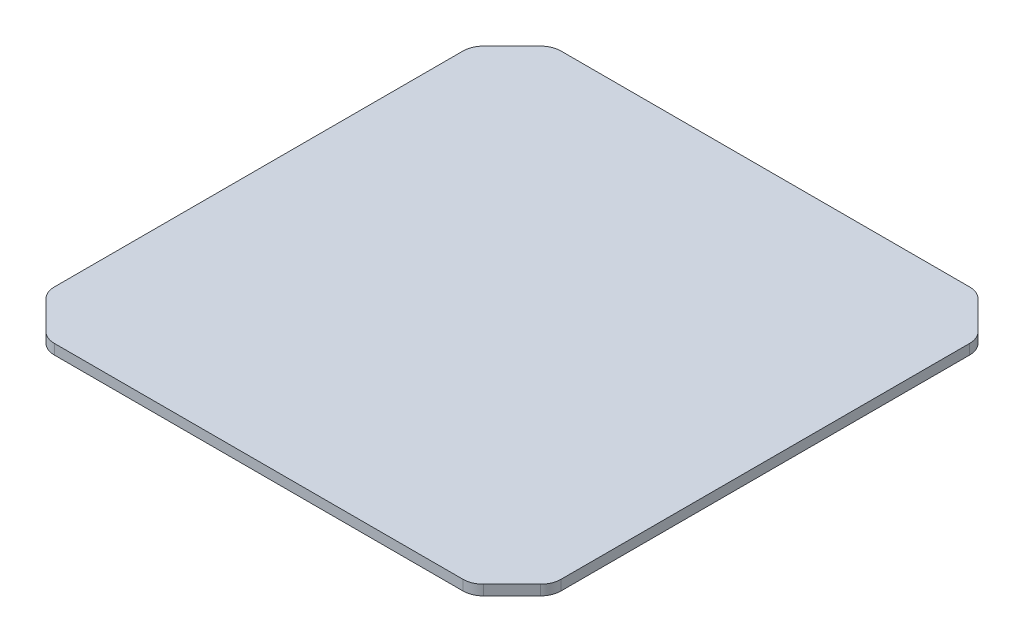
ISO-10303-21;
HEADER;
FILE_DESCRIPTION(('STEP AP214'),'2;1');
FILE_NAME('part.step','',(''),(''),'','','');
FILE_SCHEMA(('AUTOMOTIVE_DESIGN { 1 0 10303 214 1 1 1 1 }'));
ENDSEC;
DATA;
#1=APPLICATION_CONTEXT('core data for automotive mechanical design processes');
#2=APPLICATION_PROTOCOL_DEFINITION('international standard','automotive_design',2000,#1);
#3=PRODUCT_CONTEXT('',#1,'mechanical');
#4=PRODUCT('Part','Part','',(#3));
#5=PRODUCT_RELATED_PRODUCT_CATEGORY('part','',(#4));
#6=PRODUCT_DEFINITION_FORMATION('','',#4);
#7=PRODUCT_DEFINITION_CONTEXT('part definition',#1,'design');
#8=PRODUCT_DEFINITION('design','',#6,#7);
#9=PRODUCT_DEFINITION_SHAPE('','',#8);
#10=(LENGTH_UNIT() NAMED_UNIT(*) SI_UNIT(.MILLI.,.METRE.));
#11=(NAMED_UNIT(*) PLANE_ANGLE_UNIT() SI_UNIT($,.RADIAN.));
#12=(NAMED_UNIT(*) SI_UNIT($,.STERADIAN.) SOLID_ANGLE_UNIT());
#13=UNCERTAINTY_MEASURE_WITH_UNIT(LENGTH_MEASURE(1.E-05),#10,'distance_accuracy_value','');
#14=(GEOMETRIC_REPRESENTATION_CONTEXT(3) GLOBAL_UNCERTAINTY_ASSIGNED_CONTEXT((#13)) GLOBAL_UNIT_ASSIGNED_CONTEXT((#10,
#11,#12)) REPRESENTATION_CONTEXT('',''));
#15=CARTESIAN_POINT('',(0.,0.,0.));
#16=DIRECTION('',(0.,0.,1.));
#17=DIRECTION('',(1.,0.,0.));
#18=AXIS2_PLACEMENT_3D('',#15,#16,#17);
#19=CARTESIAN_POINT('',(125.,5.,125.));
#20=DIRECTION('',(-1.,0.,0.));
#21=DIRECTION('',(0.,0.,1.));
#22=AXIS2_PLACEMENT_3D('',#19,#20,#21);
#23=PLANE('',#22);
#24=DIRECTION('',(0.,0.,-1.));
#25=VECTOR('',#24,1.);
#26=CARTESIAN_POINT('',(125.,0.,125.));
#27=LINE('',#26,#25);
#28=CARTESIAN_POINT('',(125.,0.,100.857864376269));
#29=VERTEX_POINT('',#28);
#30=CARTESIAN_POINT('',(125.,0.,-100.857864376269));
#31=VERTEX_POINT('',#30);
#32=EDGE_CURVE('E170',#29,#31,#27,.T.);
#33=ORIENTED_EDGE('',*,*,#32,.T.);
#34=DIRECTION('',(0.,-1.,0.));
#35=VECTOR('',#34,1.);
#36=CARTESIAN_POINT('',(125.,5.,-100.857864376269));
#37=LINE('',#36,#35);
#38=CARTESIAN_POINT('',(125.,5.,-100.857864376269));
#39=VERTEX_POINT('',#38);
#40=EDGE_CURVE('E174',#31,#39,#37,.F.);
#41=ORIENTED_EDGE('',*,*,#40,.T.);
#42=DIRECTION('',(0.,0.,-1.));
#43=VECTOR('',#42,1.);
#44=CARTESIAN_POINT('',(125.,5.,125.));
#45=LINE('',#44,#43);
#46=CARTESIAN_POINT('',(125.,5.,100.857864376269));
#47=VERTEX_POINT('',#46);
#48=EDGE_CURVE('E173',#47,#39,#45,.T.);
#49=ORIENTED_EDGE('',*,*,#48,.F.);
#50=DIRECTION('',(0.,1.,0.));
#51=VECTOR('',#50,1.);
#52=CARTESIAN_POINT('',(125.,0.,100.857864376269));
#53=LINE('',#52,#51);
#54=EDGE_CURVE('E158',#47,#29,#53,.F.);
#55=ORIENTED_EDGE('',*,*,#54,.T.);
#56=EDGE_LOOP('',(#33,#41,#49,#55));
#57=FACE_BOUND('',#56,.T.);
#58=ADVANCED_FACE('F41',(#57),#23,.F.);
#59=CARTESIAN_POINT('',(-125.,5.,-125.));
#60=DIRECTION('',(0.,0.,1.));
#61=DIRECTION('',(1.,0.,0.));
#62=AXIS2_PLACEMENT_3D('',#59,#60,#61);
#63=PLANE('',#62);
#64=DIRECTION('',(-1.,0.,0.));
#65=VECTOR('',#64,1.);
#66=CARTESIAN_POINT('',(-125.,5.,-125.));
#67=LINE('',#66,#65);
#68=CARTESIAN_POINT('',(100.857864376269,5.,-125.));
#69=VERTEX_POINT('',#68);
#70=CARTESIAN_POINT('',(-100.857864376269,5.,-125.));
#71=VERTEX_POINT('',#70);
#72=EDGE_CURVE('E293',#69,#71,#67,.T.);
#73=ORIENTED_EDGE('',*,*,#72,.F.);
#74=DIRECTION('',(0.,1.,0.));
#75=VECTOR('',#74,1.);
#76=CARTESIAN_POINT('',(100.857864376269,0.,-125.));
#77=LINE('',#76,#75);
#78=CARTESIAN_POINT('',(100.857864376269,0.,-125.));
#79=VERTEX_POINT('',#78);
#80=EDGE_CURVE('E249',#69,#79,#77,.F.);
#81=ORIENTED_EDGE('',*,*,#80,.T.);
#82=DIRECTION('',(-1.,0.,0.));
#83=VECTOR('',#82,1.);
#84=CARTESIAN_POINT('',(-125.,0.,-125.));
#85=LINE('',#84,#83);
#86=CARTESIAN_POINT('',(-100.857864376269,0.,-125.));
#87=VERTEX_POINT('',#86);
#88=EDGE_CURVE('E181',#79,#87,#85,.T.);
#89=ORIENTED_EDGE('',*,*,#88,.T.);
#90=DIRECTION('',(0.,-1.,0.));
#91=VECTOR('',#90,1.);
#92=CARTESIAN_POINT('',(-100.857864376269,5.,-125.));
#93=LINE('',#92,#91);
#94=EDGE_CURVE('E246',#87,#71,#93,.F.);
#95=ORIENTED_EDGE('',*,*,#94,.T.);
#96=EDGE_LOOP('',(#73,#81,#89,#95));
#97=FACE_BOUND('',#96,.T.);
#98=ADVANCED_FACE('F314',(#97),#63,.F.);
#99=CARTESIAN_POINT('',(-125.,5.,125.));
#100=DIRECTION('',(1.,0.,0.));
#101=DIRECTION('',(0.,0.,-1.));
#102=AXIS2_PLACEMENT_3D('',#99,#100,#101);
#103=PLANE('',#102);
#104=DIRECTION('',(0.,0.,1.));
#105=VECTOR('',#104,1.);
#106=CARTESIAN_POINT('',(-125.,5.,125.));
#107=LINE('',#106,#105);
#108=CARTESIAN_POINT('',(-125.,5.,-100.857864376269));
#109=VERTEX_POINT('',#108);
#110=CARTESIAN_POINT('',(-125.,5.,100.857864376269));
#111=VERTEX_POINT('',#110);
#112=EDGE_CURVE('E292',#109,#111,#107,.T.);
#113=ORIENTED_EDGE('',*,*,#112,.F.);
#114=DIRECTION('',(0.,1.,0.));
#115=VECTOR('',#114,1.);
#116=CARTESIAN_POINT('',(-125.,0.,-100.857864376269));
#117=LINE('',#116,#115);
#118=CARTESIAN_POINT('',(-125.,0.,-100.857864376269));
#119=VERTEX_POINT('',#118);
#120=EDGE_CURVE('E255',#109,#119,#117,.F.);
#121=ORIENTED_EDGE('',*,*,#120,.T.);
#122=DIRECTION('',(0.,0.,1.));
#123=VECTOR('',#122,1.);
#124=CARTESIAN_POINT('',(-125.,0.,125.));
#125=LINE('',#124,#123);
#126=CARTESIAN_POINT('',(-125.,0.,100.857864376269));
#127=VERTEX_POINT('',#126);
#128=EDGE_CURVE('E184',#119,#127,#125,.T.);
#129=ORIENTED_EDGE('',*,*,#128,.T.);
#130=DIRECTION('',(0.,-1.,0.));
#131=VECTOR('',#130,1.);
#132=CARTESIAN_POINT('',(-125.,5.,100.857864376269));
#133=LINE('',#132,#131);
#134=EDGE_CURVE('E252',#127,#111,#133,.F.);
#135=ORIENTED_EDGE('',*,*,#134,.T.);
#136=EDGE_LOOP('',(#113,#121,#129,#135));
#137=FACE_BOUND('',#136,.T.);
#138=ADVANCED_FACE('F319',(#137),#103,.F.);
#139=CARTESIAN_POINT('',(-125.,5.,125.));
#140=DIRECTION('',(0.,0.,-1.));
#141=DIRECTION('',(-1.,0.,0.));
#142=AXIS2_PLACEMENT_3D('',#139,#140,#141);
#143=PLANE('',#142);
#144=DIRECTION('',(1.,0.,0.));
#145=VECTOR('',#144,1.);
#146=CARTESIAN_POINT('',(-125.,0.,125.));
#147=LINE('',#146,#145);
#148=CARTESIAN_POINT('',(-100.857864376269,0.,125.));
#149=VERTEX_POINT('',#148);
#150=CARTESIAN_POINT('',(100.857864376269,0.,125.));
#151=VERTEX_POINT('',#150);
#152=EDGE_CURVE('E192',#149,#151,#147,.T.);
#153=ORIENTED_EDGE('',*,*,#152,.T.);
#154=DIRECTION('',(0.,-1.,0.));
#155=VECTOR('',#154,1.);
#156=CARTESIAN_POINT('',(100.857864376269,5.,125.));
#157=LINE('',#156,#155);
#158=CARTESIAN_POINT('',(100.857864376269,5.,125.));
#159=VERTEX_POINT('',#158);
#160=EDGE_CURVE('E264',#151,#159,#157,.F.);
#161=ORIENTED_EDGE('',*,*,#160,.T.);
#162=DIRECTION('',(1.,0.,0.));
#163=VECTOR('',#162,1.);
#164=CARTESIAN_POINT('',(-125.,5.,125.));
#165=LINE('',#164,#163);
#166=CARTESIAN_POINT('',(-100.857864376269,5.,125.));
#167=VERTEX_POINT('',#166);
#168=EDGE_CURVE('E187',#167,#159,#165,.T.);
#169=ORIENTED_EDGE('',*,*,#168,.F.);
#170=DIRECTION('',(0.,1.,0.));
#171=VECTOR('',#170,1.);
#172=CARTESIAN_POINT('',(-100.857864376269,0.,125.));
#173=LINE('',#172,#171);
#174=EDGE_CURVE('E261',#167,#149,#173,.F.);
#175=ORIENTED_EDGE('',*,*,#174,.T.);
#176=EDGE_LOOP('',(#153,#161,#169,#175));
#177=FACE_BOUND('',#176,.T.);
#178=ADVANCED_FACE('F285',(#177),#143,.F.);
#179=CARTESIAN_POINT('',(0.,5.,0.));
#180=DIRECTION('',(0.,-1.,0.));
#181=DIRECTION('',(0.,0.,-1.));
#182=AXIS2_PLACEMENT_3D('',#179,#180,#181);
#183=PLANE('',#182);
#184=ORIENTED_EDGE('',*,*,#48,.T.);
#185=CARTESIAN_POINT('',(115.,5.,-100.857864376269));
#186=DIRECTION('',(0.,-1.,0.));
#187=DIRECTION('',(0.,0.,-1.));
#188=AXIS2_PLACEMENT_3D('',#185,#186,#187);
#189=CIRCLE('',#188,10.);
#190=CARTESIAN_POINT('',(122.071067811866,5.,-107.928932188134));
#191=VERTEX_POINT('',#190);
#192=EDGE_CURVE('E230',#39,#191,#189,.F.);
#193=ORIENTED_EDGE('',*,*,#192,.T.);
#194=DIRECTION('',(0.707106781186546,0.,0.707106781186549));
#195=VECTOR('',#194,1.);
#196=CARTESIAN_POINT('',(105.,5.,-125.));
#197=LINE('',#196,#195);
#198=CARTESIAN_POINT('',(107.928932188135,5.,-122.071067811865));
#199=VERTEX_POINT('',#198);
#200=EDGE_CURVE('E175',#191,#199,#197,.F.);
#201=ORIENTED_EDGE('',*,*,#200,.T.);
#202=CARTESIAN_POINT('',(100.857864376269,5.,-115.));
#203=DIRECTION('',(0.,-1.,0.));
#204=DIRECTION('',(0.,0.,-1.));
#205=AXIS2_PLACEMENT_3D('',#202,#203,#204);
#206=CIRCLE('',#205,10.);
#207=EDGE_CURVE('E228',#199,#69,#206,.F.);
#208=ORIENTED_EDGE('',*,*,#207,.T.);
#209=ORIENTED_EDGE('',*,*,#72,.T.);
#210=CARTESIAN_POINT('',(-100.857864376269,5.,-115.));
#211=DIRECTION('',(0.,-1.,0.));
#212=DIRECTION('',(0.,0.,-1.));
#213=AXIS2_PLACEMENT_3D('',#210,#211,#212);
#214=CIRCLE('',#213,10.);
#215=CARTESIAN_POINT('',(-107.928932188134,5.,-122.071067811866));
#216=VERTEX_POINT('',#215);
#217=EDGE_CURVE('E224',#71,#216,#214,.F.);
#218=ORIENTED_EDGE('',*,*,#217,.T.);
#219=DIRECTION('',(0.707106781186549,0.,-0.707106781186547));
#220=VECTOR('',#219,1.);
#221=CARTESIAN_POINT('',(-125.,5.,-105.));
#222=LINE('',#221,#220);
#223=CARTESIAN_POINT('',(-122.071067811865,5.,-107.928932188135));
#224=VERTEX_POINT('',#223);
#225=EDGE_CURVE('E204',#216,#224,#222,.F.);
#226=ORIENTED_EDGE('',*,*,#225,.T.);
#227=CARTESIAN_POINT('',(-115.,5.,-100.857864376269));
#228=DIRECTION('',(0.,-1.,0.));
#229=DIRECTION('',(0.,0.,-1.));
#230=AXIS2_PLACEMENT_3D('',#227,#228,#229);
#231=CIRCLE('',#230,10.);
#232=EDGE_CURVE('E226',#224,#109,#231,.F.);
#233=ORIENTED_EDGE('',*,*,#232,.T.);
#234=ORIENTED_EDGE('',*,*,#112,.T.);
#235=CARTESIAN_POINT('',(-115.,5.,100.857864376269));
#236=DIRECTION('',(0.,-1.,0.));
#237=DIRECTION('',(0.,0.,-1.));
#238=AXIS2_PLACEMENT_3D('',#235,#236,#237);
#239=CIRCLE('',#238,10.);
#240=CARTESIAN_POINT('',(-122.071067811865,5.,107.928932188134));
#241=VERTEX_POINT('',#240);
#242=EDGE_CURVE('E218',#111,#241,#239,.F.);
#243=ORIENTED_EDGE('',*,*,#242,.T.);
#244=DIRECTION('',(-0.707106781186547,0.,-0.707106781186549));
#245=VECTOR('',#244,1.);
#246=CARTESIAN_POINT('',(-105.,5.,125.));
#247=LINE('',#246,#245);
#248=CARTESIAN_POINT('',(-107.928932188134,5.,122.071067811865));
#249=VERTEX_POINT('',#248);
#250=EDGE_CURVE('E207',#241,#249,#247,.F.);
#251=ORIENTED_EDGE('',*,*,#250,.T.);
#252=CARTESIAN_POINT('',(-100.857864376269,5.,115.));
#253=DIRECTION('',(0.,-1.,0.));
#254=DIRECTION('',(0.,0.,-1.));
#255=AXIS2_PLACEMENT_3D('',#252,#253,#254);
#256=CIRCLE('',#255,10.);
#257=EDGE_CURVE('E216',#249,#167,#256,.F.);
#258=ORIENTED_EDGE('',*,*,#257,.T.);
#259=ORIENTED_EDGE('',*,*,#168,.T.);
#260=CARTESIAN_POINT('',(100.857864376269,5.,115.));
#261=DIRECTION('',(0.,-1.,0.));
#262=DIRECTION('',(0.,0.,-1.));
#263=AXIS2_PLACEMENT_3D('',#260,#261,#262);
#264=CIRCLE('',#263,10.);
#265=CARTESIAN_POINT('',(107.928932188135,5.,122.071067811865));
#266=VERTEX_POINT('',#265);
#267=EDGE_CURVE('E222',#159,#266,#264,.F.);
#268=ORIENTED_EDGE('',*,*,#267,.T.);
#269=DIRECTION('',(-0.707106781186548,0.,0.707106781186547));
#270=VECTOR('',#269,1.);
#271=CARTESIAN_POINT('',(125.,5.,105.));
#272=LINE('',#271,#270);
#273=CARTESIAN_POINT('',(122.071067811866,5.,107.928932188135));
#274=VERTEX_POINT('',#273);
#275=EDGE_CURVE('E210',#266,#274,#272,.F.);
#276=ORIENTED_EDGE('',*,*,#275,.T.);
#277=CARTESIAN_POINT('',(115.,5.,100.857864376269));
#278=DIRECTION('',(0.,-1.,0.));
#279=DIRECTION('',(0.,0.,-1.));
#280=AXIS2_PLACEMENT_3D('',#277,#278,#279);
#281=CIRCLE('',#280,10.);
#282=EDGE_CURVE('E220',#274,#47,#281,.F.);
#283=ORIENTED_EDGE('',*,*,#282,.T.);
#284=EDGE_LOOP('',(#184,#193,#201,#208,#209,#218,#226,#233,#234,#243,#251,#258,#259,#268,#276,#283));
#285=FACE_BOUND('',#284,.T.);
#286=ADVANCED_FACE('F278',(#285),#183,.F.);
#287=CARTESIAN_POINT('',(0.,0.,0.));
#288=DIRECTION('',(0.,-1.,0.));
#289=DIRECTION('',(0.,0.,-1.));
#290=AXIS2_PLACEMENT_3D('',#287,#288,#289);
#291=PLANE('',#290);
#292=DIRECTION('',(-0.707106781186546,0.,-0.707106781186549));
#293=VECTOR('',#292,1.);
#294=CARTESIAN_POINT('',(115.,0.,-115.));
#295=LINE('',#294,#293);
#296=CARTESIAN_POINT('',(107.928932188135,0.,-122.071067811865));
#297=VERTEX_POINT('',#296);
#298=CARTESIAN_POINT('',(122.071067811866,0.,-107.928932188134));
#299=VERTEX_POINT('',#298);
#300=EDGE_CURVE('E202',#297,#299,#295,.F.);
#301=ORIENTED_EDGE('',*,*,#300,.T.);
#302=CARTESIAN_POINT('',(115.,0.,-100.857864376269));
#303=DIRECTION('',(0.,-1.,0.));
#304=DIRECTION('',(0.,0.,-1.));
#305=AXIS2_PLACEMENT_3D('',#302,#303,#304);
#306=CIRCLE('',#305,10.);
#307=EDGE_CURVE('E180',#299,#31,#306,.T.);
#308=ORIENTED_EDGE('',*,*,#307,.T.);
#309=ORIENTED_EDGE('',*,*,#32,.F.);
#310=CARTESIAN_POINT('',(115.,0.,100.857864376269));
#311=DIRECTION('',(0.,-1.,0.));
#312=DIRECTION('',(0.,0.,-1.));
#313=AXIS2_PLACEMENT_3D('',#310,#311,#312);
#314=CIRCLE('',#313,10.);
#315=CARTESIAN_POINT('',(122.071067811866,0.,107.928932188135));
#316=VERTEX_POINT('',#315);
#317=EDGE_CURVE('E154',#29,#316,#314,.T.);
#318=ORIENTED_EDGE('',*,*,#317,.T.);
#319=DIRECTION('',(0.707106781186548,0.,-0.707106781186547));
#320=VECTOR('',#319,1.);
#321=CARTESIAN_POINT('',(115.,0.,115.));
#322=LINE('',#321,#320);
#323=CARTESIAN_POINT('',(107.928932188135,0.,122.071067811865));
#324=VERTEX_POINT('',#323);
#325=EDGE_CURVE('E200',#316,#324,#322,.F.);
#326=ORIENTED_EDGE('',*,*,#325,.T.);
#327=CARTESIAN_POINT('',(100.857864376269,0.,115.));
#328=DIRECTION('',(0.,-1.,0.));
#329=DIRECTION('',(0.,0.,-1.));
#330=AXIS2_PLACEMENT_3D('',#327,#328,#329);
#331=CIRCLE('',#330,10.);
#332=EDGE_CURVE('E163',#324,#151,#331,.T.);
#333=ORIENTED_EDGE('',*,*,#332,.T.);
#334=ORIENTED_EDGE('',*,*,#152,.F.);
#335=CARTESIAN_POINT('',(-100.857864376269,0.,115.));
#336=DIRECTION('',(0.,-1.,0.));
#337=DIRECTION('',(0.,0.,-1.));
#338=AXIS2_PLACEMENT_3D('',#335,#336,#337);
#339=CIRCLE('',#338,10.);
#340=CARTESIAN_POINT('',(-107.928932188135,0.,122.071067811866));
#341=VERTEX_POINT('',#340);
#342=EDGE_CURVE('E236',#149,#341,#339,.T.);
#343=ORIENTED_EDGE('',*,*,#342,.T.);
#344=DIRECTION('',(0.707106781186547,0.,0.707106781186549));
#345=VECTOR('',#344,1.);
#346=CARTESIAN_POINT('',(-115.,0.,115.));
#347=LINE('',#346,#345);
#348=CARTESIAN_POINT('',(-122.071067811866,0.,107.928932188134));
#349=VERTEX_POINT('',#348);
#350=EDGE_CURVE('E197',#341,#349,#347,.F.);
#351=ORIENTED_EDGE('',*,*,#350,.T.);
#352=CARTESIAN_POINT('',(-115.,0.,100.857864376269));
#353=DIRECTION('',(0.,-1.,0.));
#354=DIRECTION('',(0.,0.,-1.));
#355=AXIS2_PLACEMENT_3D('',#352,#353,#354);
#356=CIRCLE('',#355,10.);
#357=EDGE_CURVE('E164',#349,#127,#356,.T.);
#358=ORIENTED_EDGE('',*,*,#357,.T.);
#359=ORIENTED_EDGE('',*,*,#128,.F.);
#360=CARTESIAN_POINT('',(-115.,0.,-100.857864376269));
#361=DIRECTION('',(0.,-1.,0.));
#362=DIRECTION('',(0.,0.,-1.));
#363=AXIS2_PLACEMENT_3D('',#360,#361,#362);
#364=CIRCLE('',#363,10.);
#365=CARTESIAN_POINT('',(-122.071067811865,0.,-107.928932188135));
#366=VERTEX_POINT('',#365);
#367=EDGE_CURVE('E63',#119,#366,#364,.T.);
#368=ORIENTED_EDGE('',*,*,#367,.T.);
#369=DIRECTION('',(-0.707106781186549,0.,0.707106781186547));
#370=VECTOR('',#369,1.);
#371=CARTESIAN_POINT('',(-115.,0.,-115.));
#372=LINE('',#371,#370);
#373=CARTESIAN_POINT('',(-107.928932188134,0.,-122.071067811865));
#374=VERTEX_POINT('',#373);
#375=EDGE_CURVE('E195',#366,#374,#372,.F.);
#376=ORIENTED_EDGE('',*,*,#375,.T.);
#377=CARTESIAN_POINT('',(-100.857864376269,0.,-115.));
#378=DIRECTION('',(0.,-1.,0.));
#379=DIRECTION('',(0.,0.,-1.));
#380=AXIS2_PLACEMENT_3D('',#377,#378,#379);
#381=CIRCLE('',#380,10.);
#382=EDGE_CURVE('E240',#374,#87,#381,.T.);
#383=ORIENTED_EDGE('',*,*,#382,.T.);
#384=ORIENTED_EDGE('',*,*,#88,.F.);
#385=CARTESIAN_POINT('',(100.857864376269,0.,-115.));
#386=DIRECTION('',(0.,-1.,0.));
#387=DIRECTION('',(0.,0.,-1.));
#388=AXIS2_PLACEMENT_3D('',#385,#386,#387);
#389=CIRCLE('',#388,10.);
#390=EDGE_CURVE('E243',#79,#297,#389,.T.);
#391=ORIENTED_EDGE('',*,*,#390,.T.);
#392=EDGE_LOOP('',(#301,#308,#309,#318,#326,#333,#334,#343,#351,#358,#359,#368,#376,#383,#384,#391));
#393=FACE_BOUND('',#392,.T.);
#394=ADVANCED_FACE('F178',(#393),#291,.T.);
#395=CARTESIAN_POINT('',(105.,5.,-125.));
#396=DIRECTION('',(-0.707106781186549,0.,0.707106781186546));
#397=DIRECTION('',(0.,-1.,0.));
#398=AXIS2_PLACEMENT_3D('',#395,#396,#397);
#399=PLANE('',#398);
#400=ORIENTED_EDGE('',*,*,#200,.F.);
#401=DIRECTION('',(0.,1.,0.));
#402=VECTOR('',#401,1.);
#403=CARTESIAN_POINT('',(122.071067811866,0.,-107.928932188134));
#404=LINE('',#403,#402);
#405=EDGE_CURVE('E234',#191,#299,#404,.F.);
#406=ORIENTED_EDGE('',*,*,#405,.T.);
#407=ORIENTED_EDGE('',*,*,#300,.F.);
#408=DIRECTION('',(0.,-1.,0.));
#409=VECTOR('',#408,1.);
#410=CARTESIAN_POINT('',(107.928932188135,5.,-122.071067811865));
#411=LINE('',#410,#409);
#412=EDGE_CURVE('E232',#297,#199,#411,.F.);
#413=ORIENTED_EDGE('',*,*,#412,.T.);
#414=EDGE_LOOP('',(#400,#406,#407,#413));
#415=FACE_BOUND('',#414,.T.);
#416=ADVANCED_FACE('F302',(#415),#399,.F.);
#417=CARTESIAN_POINT('',(125.,5.,105.));
#418=DIRECTION('',(-0.707106781186547,0.,-0.707106781186548));
#419=DIRECTION('',(0.,-1.,0.));
#420=AXIS2_PLACEMENT_3D('',#417,#418,#419);
#421=PLANE('',#420);
#422=ORIENTED_EDGE('',*,*,#275,.F.);
#423=DIRECTION('',(0.,1.,0.));
#424=VECTOR('',#423,1.);
#425=CARTESIAN_POINT('',(107.928932188135,0.,122.071067811865));
#426=LINE('',#425,#424);
#427=EDGE_CURVE('E268',#266,#324,#426,.F.);
#428=ORIENTED_EDGE('',*,*,#427,.T.);
#429=ORIENTED_EDGE('',*,*,#325,.F.);
#430=DIRECTION('',(0.,-1.,0.));
#431=VECTOR('',#430,1.);
#432=CARTESIAN_POINT('',(122.071067811866,5.,107.928932188135));
#433=LINE('',#432,#431);
#434=EDGE_CURVE('E159',#316,#274,#433,.F.);
#435=ORIENTED_EDGE('',*,*,#434,.T.);
#436=EDGE_LOOP('',(#422,#428,#429,#435));
#437=FACE_BOUND('',#436,.T.);
#438=ADVANCED_FACE('F300',(#437),#421,.F.);
#439=CARTESIAN_POINT('',(-105.,5.,125.));
#440=DIRECTION('',(0.707106781186549,0.,-0.707106781186547));
#441=DIRECTION('',(0.,-1.,0.));
#442=AXIS2_PLACEMENT_3D('',#439,#440,#441);
#443=PLANE('',#442);
#444=ORIENTED_EDGE('',*,*,#250,.F.);
#445=DIRECTION('',(0.,1.,0.));
#446=VECTOR('',#445,1.);
#447=CARTESIAN_POINT('',(-122.071067811865,0.,107.928932188134));
#448=LINE('',#447,#446);
#449=EDGE_CURVE('E11',#241,#349,#448,.F.);
#450=ORIENTED_EDGE('',*,*,#449,.T.);
#451=ORIENTED_EDGE('',*,*,#350,.F.);
#452=DIRECTION('',(0.,-1.,0.));
#453=VECTOR('',#452,1.);
#454=CARTESIAN_POINT('',(-107.928932188134,5.,122.071067811865));
#455=LINE('',#454,#453);
#456=EDGE_CURVE('E49',#341,#249,#455,.F.);
#457=ORIENTED_EDGE('',*,*,#456,.T.);
#458=EDGE_LOOP('',(#444,#450,#451,#457));
#459=FACE_BOUND('',#458,.T.);
#460=ADVANCED_FACE('F273',(#459),#443,.F.);
#461=CARTESIAN_POINT('',(-125.,5.,-105.));
#462=DIRECTION('',(0.707106781186546,0.,0.707106781186548));
#463=DIRECTION('',(0.,-1.,0.));
#464=AXIS2_PLACEMENT_3D('',#461,#462,#463);
#465=PLANE('',#464);
#466=ORIENTED_EDGE('',*,*,#375,.F.);
#467=DIRECTION('',(0.,-1.,0.));
#468=VECTOR('',#467,1.);
#469=CARTESIAN_POINT('',(-122.071067811865,5.,-107.928932188135));
#470=LINE('',#469,#468);
#471=EDGE_CURVE('E259',#366,#224,#470,.F.);
#472=ORIENTED_EDGE('',*,*,#471,.T.);
#473=ORIENTED_EDGE('',*,*,#225,.F.);
#474=DIRECTION('',(0.,1.,0.));
#475=VECTOR('',#474,1.);
#476=CARTESIAN_POINT('',(-107.928932188134,0.,-122.071067811865));
#477=LINE('',#476,#475);
#478=EDGE_CURVE('E56',#216,#374,#477,.F.);
#479=ORIENTED_EDGE('',*,*,#478,.T.);
#480=EDGE_LOOP('',(#466,#472,#473,#479));
#481=FACE_BOUND('',#480,.T.);
#482=ADVANCED_FACE('F308',(#481),#465,.F.);
#483=CARTESIAN_POINT('',(115.,5.,-100.857864376269));
#484=DIRECTION('',(0.,1.,0.));
#485=DIRECTION('',(0.,0.,1.));
#486=AXIS2_PLACEMENT_3D('',#483,#484,#485);
#487=CYLINDRICAL_SURFACE('',#486,10.);
#488=ORIENTED_EDGE('',*,*,#307,.F.);
#489=ORIENTED_EDGE('',*,*,#405,.F.);
#490=ORIENTED_EDGE('',*,*,#192,.F.);
#491=ORIENTED_EDGE('',*,*,#40,.F.);
#492=EDGE_LOOP('',(#488,#489,#490,#491));
#493=FACE_BOUND('',#492,.T.);
#494=ADVANCED_FACE('F337',(#493),#487,.T.);
#495=CARTESIAN_POINT('',(100.857864376269,5.,-115.));
#496=DIRECTION('',(0.,-1.,0.));
#497=DIRECTION('',(0.,0.,-1.));
#498=AXIS2_PLACEMENT_3D('',#495,#496,#497);
#499=CYLINDRICAL_SURFACE('',#498,10.);
#500=ORIENTED_EDGE('',*,*,#207,.F.);
#501=ORIENTED_EDGE('',*,*,#412,.F.);
#502=ORIENTED_EDGE('',*,*,#390,.F.);
#503=ORIENTED_EDGE('',*,*,#80,.F.);
#504=EDGE_LOOP('',(#500,#501,#502,#503));
#505=FACE_BOUND('',#504,.T.);
#506=ADVANCED_FACE('F340',(#505),#499,.T.);
#507=CARTESIAN_POINT('',(-115.,5.,-100.857864376269));
#508=DIRECTION('',(0.,-1.,0.));
#509=DIRECTION('',(0.,0.,-1.));
#510=AXIS2_PLACEMENT_3D('',#507,#508,#509);
#511=CYLINDRICAL_SURFACE('',#510,10.);
#512=ORIENTED_EDGE('',*,*,#232,.F.);
#513=ORIENTED_EDGE('',*,*,#471,.F.);
#514=ORIENTED_EDGE('',*,*,#367,.F.);
#515=ORIENTED_EDGE('',*,*,#120,.F.);
#516=EDGE_LOOP('',(#512,#513,#514,#515));
#517=FACE_BOUND('',#516,.T.);
#518=ADVANCED_FACE('F344',(#517),#511,.T.);
#519=CARTESIAN_POINT('',(-100.857864376269,5.,-115.));
#520=DIRECTION('',(0.,1.,0.));
#521=DIRECTION('',(0.,0.,1.));
#522=AXIS2_PLACEMENT_3D('',#519,#520,#521);
#523=CYLINDRICAL_SURFACE('',#522,10.);
#524=ORIENTED_EDGE('',*,*,#382,.F.);
#525=ORIENTED_EDGE('',*,*,#478,.F.);
#526=ORIENTED_EDGE('',*,*,#217,.F.);
#527=ORIENTED_EDGE('',*,*,#94,.F.);
#528=EDGE_LOOP('',(#524,#525,#526,#527));
#529=FACE_BOUND('',#528,.T.);
#530=ADVANCED_FACE('F348',(#529),#523,.T.);
#531=CARTESIAN_POINT('',(100.857864376269,5.,115.));
#532=DIRECTION('',(0.,1.,0.));
#533=DIRECTION('',(0.,0.,1.));
#534=AXIS2_PLACEMENT_3D('',#531,#532,#533);
#535=CYLINDRICAL_SURFACE('',#534,10.);
#536=ORIENTED_EDGE('',*,*,#332,.F.);
#537=ORIENTED_EDGE('',*,*,#427,.F.);
#538=ORIENTED_EDGE('',*,*,#267,.F.);
#539=ORIENTED_EDGE('',*,*,#160,.F.);
#540=EDGE_LOOP('',(#536,#537,#538,#539));
#541=FACE_BOUND('',#540,.T.);
#542=ADVANCED_FACE('F290',(#541),#535,.T.);
#543=CARTESIAN_POINT('',(115.,5.,100.857864376269));
#544=DIRECTION('',(0.,-1.,0.));
#545=DIRECTION('',(0.,0.,-1.));
#546=AXIS2_PLACEMENT_3D('',#543,#544,#545);
#547=CYLINDRICAL_SURFACE('',#546,10.);
#548=ORIENTED_EDGE('',*,*,#282,.F.);
#549=ORIENTED_EDGE('',*,*,#434,.F.);
#550=ORIENTED_EDGE('',*,*,#317,.F.);
#551=ORIENTED_EDGE('',*,*,#54,.F.);
#552=EDGE_LOOP('',(#548,#549,#550,#551));
#553=FACE_BOUND('',#552,.T.);
#554=ADVANCED_FACE('F157',(#553),#547,.T.);
#555=CARTESIAN_POINT('',(-115.,5.,100.857864376269));
#556=DIRECTION('',(0.,1.,0.));
#557=DIRECTION('',(0.,0.,1.));
#558=AXIS2_PLACEMENT_3D('',#555,#556,#557);
#559=CYLINDRICAL_SURFACE('',#558,10.);
#560=ORIENTED_EDGE('',*,*,#357,.F.);
#561=ORIENTED_EDGE('',*,*,#449,.F.);
#562=ORIENTED_EDGE('',*,*,#242,.F.);
#563=ORIENTED_EDGE('',*,*,#134,.F.);
#564=EDGE_LOOP('',(#560,#561,#562,#563));
#565=FACE_BOUND('',#564,.T.);
#566=ADVANCED_FACE('F356',(#565),#559,.T.);
#567=CARTESIAN_POINT('',(-100.857864376269,5.,115.));
#568=DIRECTION('',(0.,-1.,0.));
#569=DIRECTION('',(0.,0.,-1.));
#570=AXIS2_PLACEMENT_3D('',#567,#568,#569);
#571=CYLINDRICAL_SURFACE('',#570,10.);
#572=ORIENTED_EDGE('',*,*,#257,.F.);
#573=ORIENTED_EDGE('',*,*,#456,.F.);
#574=ORIENTED_EDGE('',*,*,#342,.F.);
#575=ORIENTED_EDGE('',*,*,#174,.F.);
#576=EDGE_LOOP('',(#572,#573,#574,#575));
#577=FACE_BOUND('',#576,.T.);
#578=ADVANCED_FACE('F43',(#577),#571,.T.);
#579=CLOSED_SHELL('',(#58,#98,#138,#178,#286,#394,#416,#438,#460,#482,#494,#506,#518,#530,#542,
#554,#566,#578));
#580=MANIFOLD_SOLID_BREP('B2',#579);
#581=ADVANCED_BREP_SHAPE_REPRESENTATION('',(#18,#580),#14);
#582=SHAPE_DEFINITION_REPRESENTATION(#9,#581);
ENDSEC;
END-ISO-10303-21;
